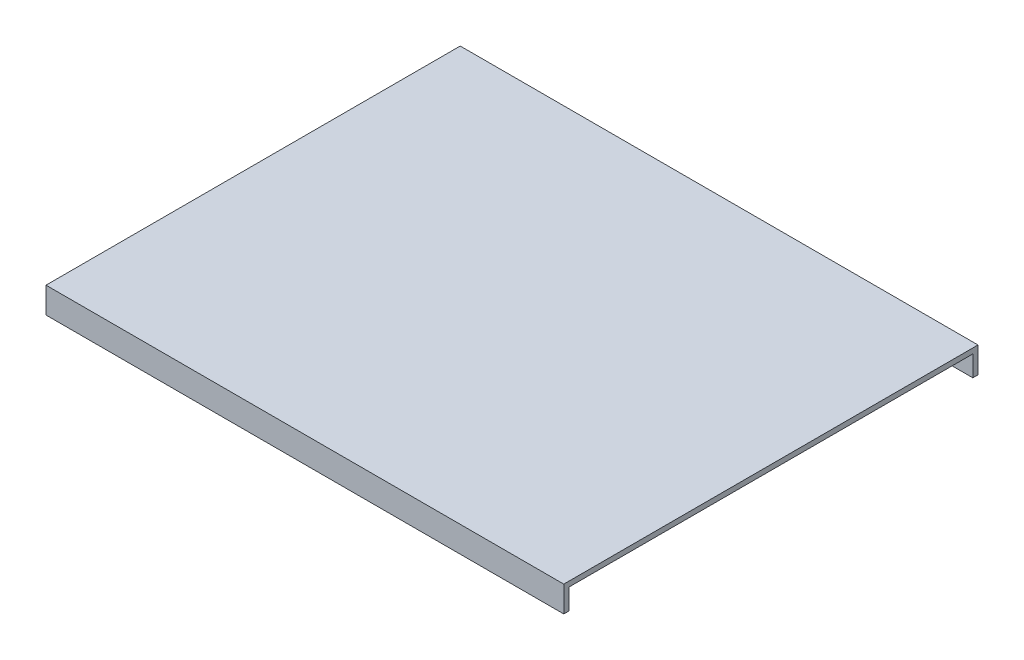
ISO-10303-21;
HEADER;
FILE_DESCRIPTION(('STEP AP214'),'2;1');
FILE_NAME('part.step','',(''),(''),'','','');
FILE_SCHEMA(('AUTOMOTIVE_DESIGN { 1 0 10303 214 1 1 1 1 }'));
ENDSEC;
DATA;
#1=APPLICATION_CONTEXT('core data for automotive mechanical design processes');
#2=APPLICATION_PROTOCOL_DEFINITION('international standard','automotive_design',2000,#1);
#3=PRODUCT_CONTEXT('',#1,'mechanical');
#4=PRODUCT('Part','Part','',(#3));
#5=PRODUCT_RELATED_PRODUCT_CATEGORY('part','',(#4));
#6=PRODUCT_DEFINITION_FORMATION('','',#4);
#7=PRODUCT_DEFINITION_CONTEXT('part definition',#1,'design');
#8=PRODUCT_DEFINITION('design','',#6,#7);
#9=PRODUCT_DEFINITION_SHAPE('','',#8);
#10=(LENGTH_UNIT() NAMED_UNIT(*) SI_UNIT(.MILLI.,.METRE.));
#11=(NAMED_UNIT(*) PLANE_ANGLE_UNIT() SI_UNIT($,.RADIAN.));
#12=(NAMED_UNIT(*) SI_UNIT($,.STERADIAN.) SOLID_ANGLE_UNIT());
#13=UNCERTAINTY_MEASURE_WITH_UNIT(LENGTH_MEASURE(1.E-05),#10,'distance_accuracy_value','');
#14=(GEOMETRIC_REPRESENTATION_CONTEXT(3) GLOBAL_UNCERTAINTY_ASSIGNED_CONTEXT((#13)) GLOBAL_UNIT_ASSIGNED_CONTEXT((#10,
#11,#12)) REPRESENTATION_CONTEXT('',''));
#15=CARTESIAN_POINT('',(0.,0.,0.));
#16=DIRECTION('',(0.,0.,1.));
#17=DIRECTION('',(1.,0.,0.));
#18=AXIS2_PLACEMENT_3D('',#15,#16,#17);
#19=CARTESIAN_POINT('',(0.,0.,800.));
#20=DIRECTION('',(0.,1.,0.));
#21=DIRECTION('',(0.,0.,1.));
#22=AXIS2_PLACEMENT_3D('',#19,#20,#21);
#23=PLANE('',#22);
#24=DIRECTION('',(0.,0.,-1.));
#25=VECTOR('',#24,1.);
#26=CARTESIAN_POINT('',(0.,0.,800.));
#27=LINE('',#26,#25);
#28=CARTESIAN_POINT('',(0.,0.,800.));
#29=VERTEX_POINT('',#28);
#30=CARTESIAN_POINT('',(0.,0.,790.));
#31=VERTEX_POINT('',#30);
#32=EDGE_CURVE('E11',#29,#31,#27,.T.);
#33=ORIENTED_EDGE('',*,*,#32,.T.);
#34=DIRECTION('',(1.,0.,0.));
#35=VECTOR('',#34,1.);
#36=CARTESIAN_POINT('',(0.,0.,790.));
#37=LINE('',#36,#35);
#38=CARTESIAN_POINT('',(1000.,0.,790.));
#39=VERTEX_POINT('',#38);
#40=EDGE_CURVE('E114',#31,#39,#37,.T.);
#41=ORIENTED_EDGE('',*,*,#40,.T.);
#42=DIRECTION('',(0.,0.,-1.));
#43=VECTOR('',#42,1.);
#44=CARTESIAN_POINT('',(1000.,0.,800.));
#45=LINE('',#44,#43);
#46=CARTESIAN_POINT('',(1000.,0.,800.));
#47=VERTEX_POINT('',#46);
#48=EDGE_CURVE('E156',#47,#39,#45,.T.);
#49=ORIENTED_EDGE('',*,*,#48,.F.);
#50=DIRECTION('',(1.,0.,0.));
#51=VECTOR('',#50,1.);
#52=CARTESIAN_POINT('',(0.,0.,800.));
#53=LINE('',#52,#51);
#54=EDGE_CURVE('E91',#29,#47,#53,.T.);
#55=ORIENTED_EDGE('',*,*,#54,.F.);
#56=EDGE_LOOP('',(#33,#41,#49,#55));
#57=FACE_BOUND('',#56,.T.);
#58=ADVANCED_FACE('F38',(#57),#23,.F.);
#59=CARTESIAN_POINT('',(0.,0.,800.));
#60=DIRECTION('',(1.,0.,0.));
#61=DIRECTION('',(0.,0.,-1.));
#62=AXIS2_PLACEMENT_3D('',#59,#60,#61);
#63=PLANE('',#62);
#64=DIRECTION('',(0.,0.,1.));
#65=VECTOR('',#64,1.);
#66=CARTESIAN_POINT('',(0.,40.,790.));
#67=LINE('',#66,#65);
#68=CARTESIAN_POINT('',(0.,40.,10.));
#69=VERTEX_POINT('',#68);
#70=CARTESIAN_POINT('',(0.,40.,790.));
#71=VERTEX_POINT('',#70);
#72=EDGE_CURVE('E123',#69,#71,#67,.T.);
#73=ORIENTED_EDGE('',*,*,#72,.T.);
#74=DIRECTION('',(0.,-1.,0.));
#75=VECTOR('',#74,1.);
#76=CARTESIAN_POINT('',(0.,0.,790.));
#77=LINE('',#76,#75);
#78=EDGE_CURVE('E117',#71,#31,#77,.T.);
#79=ORIENTED_EDGE('',*,*,#78,.T.);
#80=ORIENTED_EDGE('',*,*,#32,.F.);
#81=DIRECTION('',(0.,-1.,0.));
#82=VECTOR('',#81,1.);
#83=CARTESIAN_POINT('',(0.,0.,800.));
#84=LINE('',#83,#82);
#85=CARTESIAN_POINT('',(0.,50.,800.));
#86=VERTEX_POINT('',#85);
#87=EDGE_CURVE('E167',#86,#29,#84,.T.);
#88=ORIENTED_EDGE('',*,*,#87,.F.);
#89=DIRECTION('',(0.,0.,-1.));
#90=VECTOR('',#89,1.);
#91=CARTESIAN_POINT('',(0.,50.,800.));
#92=LINE('',#91,#90);
#93=CARTESIAN_POINT('',(0.,50.,0.));
#94=VERTEX_POINT('',#93);
#95=EDGE_CURVE('E160',#86,#94,#92,.T.);
#96=ORIENTED_EDGE('',*,*,#95,.T.);
#97=DIRECTION('',(0.,-1.,0.));
#98=VECTOR('',#97,1.);
#99=CARTESIAN_POINT('',(0.,0.,0.));
#100=LINE('',#99,#98);
#101=CARTESIAN_POINT('',(0.,0.,0.));
#102=VERTEX_POINT('',#101);
#103=EDGE_CURVE('E173',#94,#102,#100,.T.);
#104=ORIENTED_EDGE('',*,*,#103,.T.);
#105=CARTESIAN_POINT('',(0.,0.,10.));
#106=VERTEX_POINT('',#105);
#107=EDGE_CURVE('E47',#106,#102,#27,.T.);
#108=ORIENTED_EDGE('',*,*,#107,.F.);
#109=DIRECTION('',(0.,1.,0.));
#110=VECTOR('',#109,1.);
#111=CARTESIAN_POINT('',(0.,0.,10.));
#112=LINE('',#111,#110);
#113=EDGE_CURVE('E131',#106,#69,#112,.T.);
#114=ORIENTED_EDGE('',*,*,#113,.T.);
#115=EDGE_LOOP('',(#73,#79,#80,#88,#96,#104,#108,#114));
#116=FACE_BOUND('',#115,.T.);
#117=ADVANCED_FACE('F40',(#116),#63,.F.);
#118=CARTESIAN_POINT('',(1000.,0.,10.));
#119=VERTEX_POINT('',#118);
#120=CARTESIAN_POINT('',(1000.,0.,0.));
#121=VERTEX_POINT('',#120);
#122=EDGE_CURVE('E150',#119,#121,#45,.T.);
#123=ORIENTED_EDGE('',*,*,#122,.F.);
#124=DIRECTION('',(1.,0.,0.));
#125=VECTOR('',#124,1.);
#126=CARTESIAN_POINT('',(0.,0.,10.));
#127=LINE('',#126,#125);
#128=EDGE_CURVE('E54',#106,#119,#127,.T.);
#129=ORIENTED_EDGE('',*,*,#128,.F.);
#130=ORIENTED_EDGE('',*,*,#107,.T.);
#131=DIRECTION('',(1.,0.,0.));
#132=VECTOR('',#131,1.);
#133=CARTESIAN_POINT('',(0.,0.,0.));
#134=LINE('',#133,#132);
#135=EDGE_CURVE('E153',#102,#121,#134,.T.);
#136=ORIENTED_EDGE('',*,*,#135,.T.);
#137=EDGE_LOOP('',(#123,#129,#130,#136));
#138=FACE_BOUND('',#137,.T.);
#139=ADVANCED_FACE('F135',(#138),#23,.F.);
#140=CARTESIAN_POINT('',(1000.,0.,800.));
#141=DIRECTION('',(-1.,0.,0.));
#142=DIRECTION('',(0.,0.,1.));
#143=AXIS2_PLACEMENT_3D('',#140,#141,#142);
#144=PLANE('',#143);
#145=ORIENTED_EDGE('',*,*,#48,.T.);
#146=DIRECTION('',(0.,-1.,0.));
#147=VECTOR('',#146,1.);
#148=CARTESIAN_POINT('',(1000.,0.,790.));
#149=LINE('',#148,#147);
#150=CARTESIAN_POINT('',(1000.,40.,790.));
#151=VERTEX_POINT('',#150);
#152=EDGE_CURVE('E120',#151,#39,#149,.T.);
#153=ORIENTED_EDGE('',*,*,#152,.F.);
#154=DIRECTION('',(0.,0.,1.));
#155=VECTOR('',#154,1.);
#156=CARTESIAN_POINT('',(1000.,40.,790.));
#157=LINE('',#156,#155);
#158=CARTESIAN_POINT('',(1000.,40.,10.));
#159=VERTEX_POINT('',#158);
#160=EDGE_CURVE('E132',#159,#151,#157,.T.);
#161=ORIENTED_EDGE('',*,*,#160,.F.);
#162=DIRECTION('',(0.,1.,0.));
#163=VECTOR('',#162,1.);
#164=CARTESIAN_POINT('',(1000.,0.,10.));
#165=LINE('',#164,#163);
#166=EDGE_CURVE('E197',#119,#159,#165,.T.);
#167=ORIENTED_EDGE('',*,*,#166,.F.);
#168=ORIENTED_EDGE('',*,*,#122,.T.);
#169=DIRECTION('',(0.,1.,0.));
#170=VECTOR('',#169,1.);
#171=CARTESIAN_POINT('',(1000.,0.,0.));
#172=LINE('',#171,#170);
#173=CARTESIAN_POINT('',(1000.,50.,0.));
#174=VERTEX_POINT('',#173);
#175=EDGE_CURVE('E168',#121,#174,#172,.T.);
#176=ORIENTED_EDGE('',*,*,#175,.T.);
#177=DIRECTION('',(0.,0.,-1.));
#178=VECTOR('',#177,1.);
#179=CARTESIAN_POINT('',(1000.,50.,800.));
#180=LINE('',#179,#178);
#181=CARTESIAN_POINT('',(1000.,50.,800.));
#182=VERTEX_POINT('',#181);
#183=EDGE_CURVE('E157',#182,#174,#180,.T.);
#184=ORIENTED_EDGE('',*,*,#183,.F.);
#185=DIRECTION('',(0.,1.,0.));
#186=VECTOR('',#185,1.);
#187=CARTESIAN_POINT('',(1000.,0.,800.));
#188=LINE('',#187,#186);
#189=EDGE_CURVE('E180',#47,#182,#188,.T.);
#190=ORIENTED_EDGE('',*,*,#189,.F.);
#191=EDGE_LOOP('',(#145,#153,#161,#167,#168,#176,#184,#190));
#192=FACE_BOUND('',#191,.T.);
#193=ADVANCED_FACE('F141',(#192),#144,.F.);
#194=CARTESIAN_POINT('',(0.,50.,800.));
#195=DIRECTION('',(0.,-1.,0.));
#196=DIRECTION('',(0.,0.,-1.));
#197=AXIS2_PLACEMENT_3D('',#194,#195,#196);
#198=PLANE('',#197);
#199=DIRECTION('',(-1.,0.,0.));
#200=VECTOR('',#199,1.);
#201=CARTESIAN_POINT('',(0.,50.,0.));
#202=LINE('',#201,#200);
#203=EDGE_CURVE('E84',#174,#94,#202,.T.);
#204=ORIENTED_EDGE('',*,*,#203,.T.);
#205=ORIENTED_EDGE('',*,*,#95,.F.);
#206=DIRECTION('',(-1.,0.,0.));
#207=VECTOR('',#206,1.);
#208=CARTESIAN_POINT('',(0.,50.,800.));
#209=LINE('',#208,#207);
#210=EDGE_CURVE('E63',#182,#86,#209,.T.);
#211=ORIENTED_EDGE('',*,*,#210,.F.);
#212=ORIENTED_EDGE('',*,*,#183,.T.);
#213=EDGE_LOOP('',(#204,#205,#211,#212));
#214=FACE_BOUND('',#213,.T.);
#215=ADVANCED_FACE('F146',(#214),#198,.F.);
#216=CARTESIAN_POINT('',(0.,0.,800.));
#217=DIRECTION('',(0.,0.,-1.));
#218=DIRECTION('',(-1.,0.,0.));
#219=AXIS2_PLACEMENT_3D('',#216,#217,#218);
#220=PLANE('',#219);
#221=ORIENTED_EDGE('',*,*,#87,.T.);
#222=ORIENTED_EDGE('',*,*,#54,.T.);
#223=ORIENTED_EDGE('',*,*,#189,.T.);
#224=ORIENTED_EDGE('',*,*,#210,.T.);
#225=EDGE_LOOP('',(#221,#222,#223,#224));
#226=FACE_BOUND('',#225,.T.);
#227=ADVANCED_FACE('F211',(#226),#220,.F.);
#228=CARTESIAN_POINT('',(0.,0.,0.));
#229=DIRECTION('',(0.,0.,-1.));
#230=DIRECTION('',(-1.,0.,0.));
#231=AXIS2_PLACEMENT_3D('',#228,#229,#230);
#232=PLANE('',#231);
#233=ORIENTED_EDGE('',*,*,#103,.F.);
#234=ORIENTED_EDGE('',*,*,#203,.F.);
#235=ORIENTED_EDGE('',*,*,#175,.F.);
#236=ORIENTED_EDGE('',*,*,#135,.F.);
#237=EDGE_LOOP('',(#233,#234,#235,#236));
#238=FACE_BOUND('',#237,.T.);
#239=ADVANCED_FACE('F214',(#238),#232,.T.);
#240=CARTESIAN_POINT('',(0.,0.,790.));
#241=DIRECTION('',(0.,0.,1.));
#242=DIRECTION('',(1.,0.,0.));
#243=AXIS2_PLACEMENT_3D('',#240,#241,#242);
#244=PLANE('',#243);
#245=ORIENTED_EDGE('',*,*,#152,.T.);
#246=ORIENTED_EDGE('',*,*,#40,.F.);
#247=ORIENTED_EDGE('',*,*,#78,.F.);
#248=DIRECTION('',(1.,0.,0.));
#249=VECTOR('',#248,1.);
#250=CARTESIAN_POINT('',(0.,40.,790.));
#251=LINE('',#250,#249);
#252=EDGE_CURVE('E177',#71,#151,#251,.T.);
#253=ORIENTED_EDGE('',*,*,#252,.T.);
#254=EDGE_LOOP('',(#245,#246,#247,#253));
#255=FACE_BOUND('',#254,.T.);
#256=ADVANCED_FACE('F116',(#255),#244,.F.);
#257=CARTESIAN_POINT('',(0.,40.,790.));
#258=DIRECTION('',(0.,1.,0.));
#259=DIRECTION('',(0.,0.,1.));
#260=AXIS2_PLACEMENT_3D('',#257,#258,#259);
#261=PLANE('',#260);
#262=ORIENTED_EDGE('',*,*,#160,.T.);
#263=ORIENTED_EDGE('',*,*,#252,.F.);
#264=ORIENTED_EDGE('',*,*,#72,.F.);
#265=DIRECTION('',(1.,0.,0.));
#266=VECTOR('',#265,1.);
#267=CARTESIAN_POINT('',(0.,40.,10.));
#268=LINE('',#267,#266);
#269=EDGE_CURVE('E189',#69,#159,#268,.T.);
#270=ORIENTED_EDGE('',*,*,#269,.T.);
#271=EDGE_LOOP('',(#262,#263,#264,#270));
#272=FACE_BOUND('',#271,.T.);
#273=ADVANCED_FACE('F208',(#272),#261,.F.);
#274=CARTESIAN_POINT('',(0.,0.,10.));
#275=DIRECTION('',(0.,0.,-1.));
#276=DIRECTION('',(-1.,0.,0.));
#277=AXIS2_PLACEMENT_3D('',#274,#275,#276);
#278=PLANE('',#277);
#279=ORIENTED_EDGE('',*,*,#166,.T.);
#280=ORIENTED_EDGE('',*,*,#269,.F.);
#281=ORIENTED_EDGE('',*,*,#113,.F.);
#282=ORIENTED_EDGE('',*,*,#128,.T.);
#283=EDGE_LOOP('',(#279,#280,#281,#282));
#284=FACE_BOUND('',#283,.T.);
#285=ADVANCED_FACE('F205',(#284),#278,.F.);
#286=CLOSED_SHELL('',(#58,#117,#139,#193,#215,#227,#239,#256,#273,#285));
#287=MANIFOLD_SOLID_BREP('B2',#286);
#288=ADVANCED_BREP_SHAPE_REPRESENTATION('',(#18,#287),#14);
#289=SHAPE_DEFINITION_REPRESENTATION(#9,#288);
ENDSEC;
END-ISO-10303-21;
